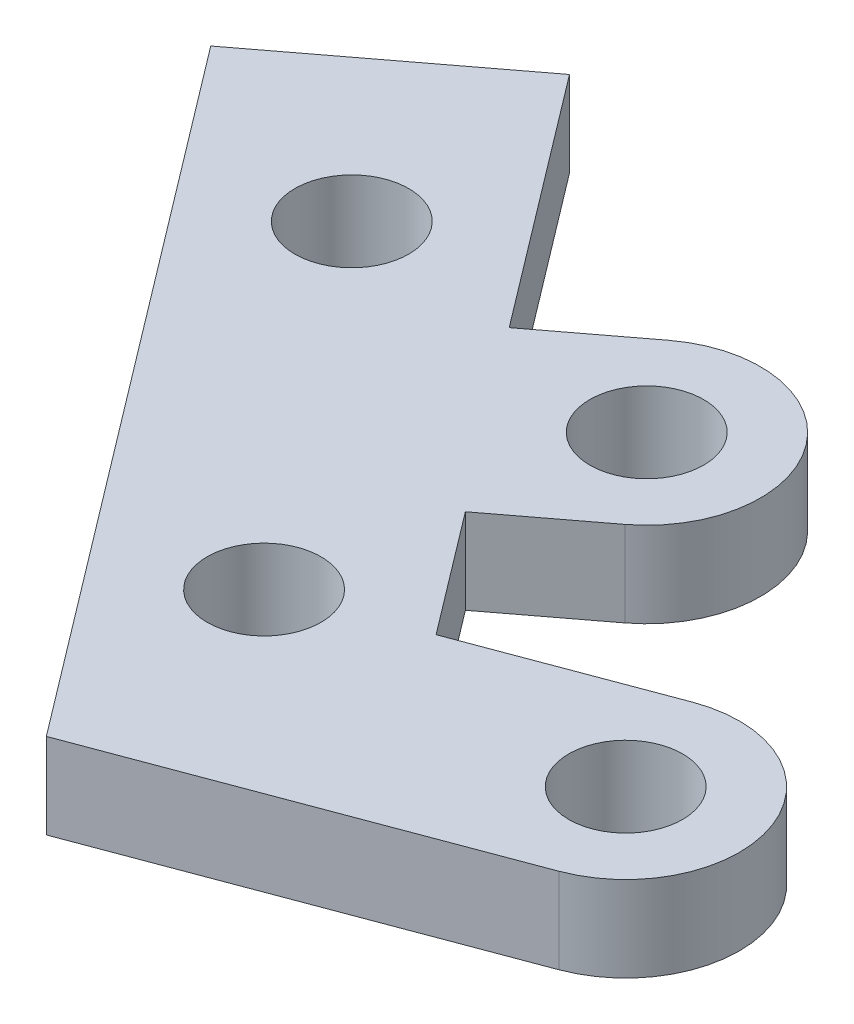
ISO-10303-21;
HEADER;
FILE_DESCRIPTION(('STEP AP214'),'2;1');
FILE_NAME('part.step','',(''),(''),'','','');
FILE_SCHEMA(('AUTOMOTIVE_DESIGN { 1 0 10303 214 1 1 1 1 }'));
ENDSEC;
DATA;
#1=APPLICATION_CONTEXT('core data for automotive mechanical design processes');
#2=APPLICATION_PROTOCOL_DEFINITION('international standard','automotive_design',2000,#1);
#3=PRODUCT_CONTEXT('',#1,'mechanical');
#4=PRODUCT('Part','Part','',(#3));
#5=PRODUCT_RELATED_PRODUCT_CATEGORY('part','',(#4));
#6=PRODUCT_DEFINITION_FORMATION('','',#4);
#7=PRODUCT_DEFINITION_CONTEXT('part definition',#1,'design');
#8=PRODUCT_DEFINITION('design','',#6,#7);
#9=PRODUCT_DEFINITION_SHAPE('','',#8);
#10=(LENGTH_UNIT() NAMED_UNIT(*) SI_UNIT(.MILLI.,.METRE.));
#11=(NAMED_UNIT(*) PLANE_ANGLE_UNIT() SI_UNIT($,.RADIAN.));
#12=(NAMED_UNIT(*) SI_UNIT($,.STERADIAN.) SOLID_ANGLE_UNIT());
#13=UNCERTAINTY_MEASURE_WITH_UNIT(LENGTH_MEASURE(1.E-05),#10,'distance_accuracy_value','');
#14=(GEOMETRIC_REPRESENTATION_CONTEXT(3) GLOBAL_UNCERTAINTY_ASSIGNED_CONTEXT((#13)) GLOBAL_UNIT_ASSIGNED_CONTEXT((#10,
#11,#12)) REPRESENTATION_CONTEXT('',''));
#15=CARTESIAN_POINT('',(0.,0.,0.));
#16=DIRECTION('',(0.,0.,1.));
#17=DIRECTION('',(1.,0.,0.));
#18=AXIS2_PLACEMENT_3D('',#15,#16,#17);
#19=CARTESIAN_POINT('',(74.7409529420616,3.,-139.690728276876));
#20=DIRECTION('',(0.,1.,0.));
#21=DIRECTION('',(0.,0.,1.));
#22=AXIS2_PLACEMENT_3D('',#19,#20,#21);
#23=PLANE('',#22);
#24=CARTESIAN_POINT('',(52.7185962532916,3.,-152.085226713512));
#25=DIRECTION('',(0.,1.,0.));
#26=DIRECTION('',(0.,0.,1.));
#27=AXIS2_PLACEMENT_3D('',#24,#25,#26);
#28=CIRCLE('',#27,1.99999999999998);
#29=CARTESIAN_POINT('',(52.7185962532916,3.,-150.085226713512));
#30=VERTEX_POINT('',#29);
#31=EDGE_CURVE('E224',#30,#30,#28,.T.);
#32=ORIENTED_EDGE('',*,*,#31,.F.);
#33=EDGE_LOOP('',(#32));
#34=FACE_BOUND('',#33,.T.);
#35=CARTESIAN_POINT('',(74.7409529420616,3.,-139.690728276876));
#36=DIRECTION('',(0.,1.,0.));
#37=DIRECTION('',(0.,0.,1.));
#38=AXIS2_PLACEMENT_3D('',#35,#36,#37);
#39=CIRCLE('',#38,2.);
#40=CARTESIAN_POINT('',(74.7409529420616,3.,-137.690728276876));
#41=VERTEX_POINT('',#40);
#42=EDGE_CURVE('E152',#41,#41,#39,.T.);
#43=ORIENTED_EDGE('',*,*,#42,.F.);
#44=EDGE_LOOP('',(#43));
#45=FACE_BOUND('',#44,.T.);
#46=DIRECTION('',(-0.604210332425517,0.,-0.796824870464173));
#47=VECTOR('',#46,1.);
#48=CARTESIAN_POINT('',(58.7211495000825,3.,-151.61687372757));
#49=LINE('',#48,#47);
#50=CARTESIAN_POINT('',(58.7211495000825,3.,-151.61687372757));
#51=VERTEX_POINT('',#50);
#52=CARTESIAN_POINT('',(52.0748358434018,3.,-160.381947302676));
#53=VERTEX_POINT('',#52);
#54=EDGE_CURVE('E167',#51,#53,#49,.T.);
#55=ORIENTED_EDGE('',*,*,#54,.T.);
#56=DIRECTION('',(-0.796824870464177,0.,0.604210332425512));
#57=VECTOR('',#56,1.);
#58=CARTESIAN_POINT('',(52.0748358434018,3.,-160.381947302676));
#59=LINE('',#58,#57);
#60=CARTESIAN_POINT('',(44.9034120092242,3.,-154.944054310847));
#61=VERTEX_POINT('',#60);
#62=EDGE_CURVE('E105',#53,#61,#59,.T.);
#63=ORIENTED_EDGE('',*,*,#62,.T.);
#64=DIRECTION('',(0.60421033242551,0.,0.796824870464178));
#65=VECTOR('',#64,1.);
#66=CARTESIAN_POINT('',(44.9034120092242,3.,-154.944054310847));
#67=LINE('',#66,#65);
#68=CARTESIAN_POINT('',(63.0297219819895,3.,-131.039308196921));
#69=VERTEX_POINT('',#68);
#70=EDGE_CURVE('E188',#61,#69,#67,.T.);
#71=ORIENTED_EDGE('',*,*,#70,.T.);
#72=DIRECTION('',(0.936617517739759,0.,-0.350353572071146));
#73=VECTOR('',#72,1.);
#74=CARTESIAN_POINT('',(76.1423672303462,3.,-135.944258205917));
#75=LINE('',#74,#73);
#76=CARTESIAN_POINT('',(76.1423672303462,3.,-135.944258205917));
#77=VERTEX_POINT('',#76);
#78=EDGE_CURVE('E207',#69,#77,#75,.T.);
#79=ORIENTED_EDGE('',*,*,#78,.T.);
#80=CARTESIAN_POINT('',(74.7409529420616,3.,-139.690728276876));
#81=DIRECTION('',(0.,1.,0.));
#82=DIRECTION('',(0.,0.,1.));
#83=AXIS2_PLACEMENT_3D('',#80,#81,#82);
#84=CIRCLE('',#83,4.00000000000002);
#85=CARTESIAN_POINT('',(73.339538653777,3.,-143.437198347835));
#86=VERTEX_POINT('',#85);
#87=EDGE_CURVE('E204',#77,#86,#84,.T.);
#88=ORIENTED_EDGE('',*,*,#87,.T.);
#89=DIRECTION('',(-0.936617517739759,0.,0.350353572071146));
#90=VECTOR('',#89,1.);
#91=CARTESIAN_POINT('',(66.7832160295986,3.,-140.984723343337));
#92=LINE('',#91,#90);
#93=CARTESIAN_POINT('',(66.7832160295986,3.,-140.984723343337));
#94=VERTEX_POINT('',#93);
#95=EDGE_CURVE('E206',#86,#94,#92,.T.);
#96=ORIENTED_EDGE('',*,*,#95,.T.);
#97=DIRECTION('',(-0.604210332425495,0.,-0.79682487046419));
#98=VECTOR('',#97,1.);
#99=CARTESIAN_POINT('',(66.7832160295986,3.,-140.984723343337));
#100=LINE('',#99,#98);
#101=CARTESIAN_POINT('',(63.5548321594866,3.,-145.242274763857));
#102=VERTEX_POINT('',#101);
#103=EDGE_CURVE('E130',#94,#102,#100,.T.);
#104=ORIENTED_EDGE('',*,*,#103,.T.);
#105=DIRECTION('',(0.796824870464177,0.,-0.604210332425511));
#106=VECTOR('',#105,1.);
#107=CARTESIAN_POINT('',(63.5548321594866,3.,-145.242274763857));
#108=LINE('',#107,#106);
#109=CARTESIAN_POINT('',(66.7421316413433,3.,-147.659116093559));
#110=VERTEX_POINT('',#109);
#111=EDGE_CURVE('E124',#102,#110,#108,.T.);
#112=ORIENTED_EDGE('',*,*,#111,.T.);
#113=CARTESIAN_POINT('',(64.3252903116413,3.,-150.846415575416));
#114=DIRECTION('',(0.,1.,0.));
#115=DIRECTION('',(0.,0.,1.));
#116=AXIS2_PLACEMENT_3D('',#113,#114,#115);
#117=CIRCLE('',#116,4.);
#118=CARTESIAN_POINT('',(61.9084489819392,3.,-154.033715057272));
#119=VERTEX_POINT('',#118);
#120=EDGE_CURVE('E128',#110,#119,#117,.T.);
#121=ORIENTED_EDGE('',*,*,#120,.T.);
#122=DIRECTION('',(-0.796824870464178,0.,0.60421033242551));
#123=VECTOR('',#122,1.);
#124=CARTESIAN_POINT('',(61.9084489819392,3.,-154.033715057272));
#125=LINE('',#124,#123);
#126=EDGE_CURVE('E56',#119,#51,#125,.T.);
#127=ORIENTED_EDGE('',*,*,#126,.T.);
#128=EDGE_LOOP('',(#55,#63,#71,#79,#88,#96,#104,#112,#121,#127));
#129=FACE_BOUND('',#128,.T.);
#130=CARTESIAN_POINT('',(64.3252903116413,3.,-150.846415575416));
#131=DIRECTION('',(0.,1.,0.));
#132=DIRECTION('',(0.,0.,1.));
#133=AXIS2_PLACEMENT_3D('',#130,#131,#132);
#134=CIRCLE('',#133,1.99999999999997);
#135=CARTESIAN_POINT('',(64.3252903116413,3.,-148.846415575416));
#136=VERTEX_POINT('',#135);
#137=EDGE_CURVE('E218',#136,#136,#134,.T.);
#138=ORIENTED_EDGE('',*,*,#137,.F.);
#139=EDGE_LOOP('',(#138));
#140=FACE_BOUND('',#139,.T.);
#141=CARTESIAN_POINT('',(62.3859615720995,3.,-139.336028786086));
#142=DIRECTION('',(0.,1.,0.));
#143=DIRECTION('',(0.,0.,1.));
#144=AXIS2_PLACEMENT_3D('',#141,#142,#143);
#145=CIRCLE('',#144,1.99999999999997);
#146=CARTESIAN_POINT('',(62.3859615720995,3.,-137.336028786086));
#147=VERTEX_POINT('',#146);
#148=EDGE_CURVE('E230',#147,#147,#145,.T.);
#149=ORIENTED_EDGE('',*,*,#148,.F.);
#150=EDGE_LOOP('',(#149));
#151=FACE_BOUND('',#150,.T.);
#152=ADVANCED_FACE('F39',(#34,#45,#129,#140,#151),#23,.T.);
#153=CARTESIAN_POINT('',(74.7409529420616,0.,-139.690728276876));
#154=DIRECTION('',(0.,1.,0.));
#155=DIRECTION('',(0.,0.,1.));
#156=AXIS2_PLACEMENT_3D('',#153,#154,#155);
#157=PLANE('',#156);
#158=DIRECTION('',(-0.604210332425517,0.,-0.796824870464173));
#159=VECTOR('',#158,1.);
#160=CARTESIAN_POINT('',(58.7211495000825,0.,-151.61687372757));
#161=LINE('',#160,#159);
#162=CARTESIAN_POINT('',(58.7211495000825,0.,-151.61687372757));
#163=VERTEX_POINT('',#162);
#164=CARTESIAN_POINT('',(52.0748358434018,0.,-160.381947302676));
#165=VERTEX_POINT('',#164);
#166=EDGE_CURVE('E148',#163,#165,#161,.T.);
#167=ORIENTED_EDGE('',*,*,#166,.F.);
#168=DIRECTION('',(-0.796824870464178,0.,0.60421033242551));
#169=VECTOR('',#168,1.);
#170=CARTESIAN_POINT('',(61.9084489819392,0.,-154.033715057272));
#171=LINE('',#170,#169);
#172=CARTESIAN_POINT('',(61.9084489819392,0.,-154.033715057272));
#173=VERTEX_POINT('',#172);
#174=EDGE_CURVE('E97',#173,#163,#171,.T.);
#175=ORIENTED_EDGE('',*,*,#174,.F.);
#176=CARTESIAN_POINT('',(64.3252903116413,0.,-150.846415575416));
#177=DIRECTION('',(0.,1.,0.));
#178=DIRECTION('',(0.,0.,1.));
#179=AXIS2_PLACEMENT_3D('',#176,#177,#178);
#180=CIRCLE('',#179,4.);
#181=CARTESIAN_POINT('',(66.7421316413433,0.,-147.659116093559));
#182=VERTEX_POINT('',#181);
#183=EDGE_CURVE('E91',#182,#173,#180,.T.);
#184=ORIENTED_EDGE('',*,*,#183,.F.);
#185=DIRECTION('',(0.796824870464177,0.,-0.604210332425511));
#186=VECTOR('',#185,1.);
#187=CARTESIAN_POINT('',(63.5548321594866,0.,-145.242274763857));
#188=LINE('',#187,#186);
#189=CARTESIAN_POINT('',(63.5548321594866,0.,-145.242274763857));
#190=VERTEX_POINT('',#189);
#191=EDGE_CURVE('E138',#190,#182,#188,.T.);
#192=ORIENTED_EDGE('',*,*,#191,.F.);
#193=DIRECTION('',(-0.604210332425495,0.,-0.79682487046419));
#194=VECTOR('',#193,1.);
#195=CARTESIAN_POINT('',(66.7832160295986,0.,-140.984723343337));
#196=LINE('',#195,#194);
#197=CARTESIAN_POINT('',(66.7832160295986,0.,-140.984723343337));
#198=VERTEX_POINT('',#197);
#199=EDGE_CURVE('E162',#198,#190,#196,.T.);
#200=ORIENTED_EDGE('',*,*,#199,.F.);
#201=DIRECTION('',(-0.936617517739759,0.,0.350353572071146));
#202=VECTOR('',#201,1.);
#203=CARTESIAN_POINT('',(66.7832160295986,0.,-140.984723343337));
#204=LINE('',#203,#202);
#205=CARTESIAN_POINT('',(73.339538653777,0.,-143.437198347835));
#206=VERTEX_POINT('',#205);
#207=EDGE_CURVE('E160',#206,#198,#204,.T.);
#208=ORIENTED_EDGE('',*,*,#207,.F.);
#209=CARTESIAN_POINT('',(74.7409529420616,0.,-139.690728276876));
#210=DIRECTION('',(0.,1.,0.));
#211=DIRECTION('',(0.,0.,1.));
#212=AXIS2_PLACEMENT_3D('',#209,#210,#211);
#213=CIRCLE('',#212,4.00000000000002);
#214=CARTESIAN_POINT('',(76.1423672303462,0.,-135.944258205917));
#215=VERTEX_POINT('',#214);
#216=EDGE_CURVE('E158',#215,#206,#213,.T.);
#217=ORIENTED_EDGE('',*,*,#216,.F.);
#218=DIRECTION('',(0.936617517739759,0.,-0.350353572071146));
#219=VECTOR('',#218,1.);
#220=CARTESIAN_POINT('',(76.1423672303462,0.,-135.944258205917));
#221=LINE('',#220,#219);
#222=CARTESIAN_POINT('',(63.0297219819895,0.,-131.039308196921));
#223=VERTEX_POINT('',#222);
#224=EDGE_CURVE('E156',#223,#215,#221,.T.);
#225=ORIENTED_EDGE('',*,*,#224,.F.);
#226=DIRECTION('',(0.60421033242551,0.,0.796824870464178));
#227=VECTOR('',#226,1.);
#228=CARTESIAN_POINT('',(44.9034120092242,0.,-154.944054310847));
#229=LINE('',#228,#227);
#230=CARTESIAN_POINT('',(44.9034120092242,0.,-154.944054310847));
#231=VERTEX_POINT('',#230);
#232=EDGE_CURVE('E154',#231,#223,#229,.T.);
#233=ORIENTED_EDGE('',*,*,#232,.F.);
#234=DIRECTION('',(-0.796824870464177,0.,0.604210332425512));
#235=VECTOR('',#234,1.);
#236=CARTESIAN_POINT('',(52.0748358434018,0.,-160.381947302676));
#237=LINE('',#236,#235);
#238=EDGE_CURVE('E151',#165,#231,#237,.T.);
#239=ORIENTED_EDGE('',*,*,#238,.F.);
#240=EDGE_LOOP('',(#167,#175,#184,#192,#200,#208,#217,#225,#233,#239));
#241=FACE_BOUND('',#240,.T.);
#242=CARTESIAN_POINT('',(74.7409529420616,0.,-139.690728276876));
#243=DIRECTION('',(0.,1.,0.));
#244=DIRECTION('',(0.,0.,1.));
#245=AXIS2_PLACEMENT_3D('',#242,#243,#244);
#246=CIRCLE('',#245,2.);
#247=CARTESIAN_POINT('',(74.7409529420616,0.,-137.690728276876));
#248=VERTEX_POINT('',#247);
#249=EDGE_CURVE('E215',#248,#248,#246,.T.);
#250=ORIENTED_EDGE('',*,*,#249,.T.);
#251=EDGE_LOOP('',(#250));
#252=FACE_BOUND('',#251,.T.);
#253=CARTESIAN_POINT('',(64.3252903116413,0.,-150.846415575416));
#254=DIRECTION('',(0.,1.,0.));
#255=DIRECTION('',(0.,0.,1.));
#256=AXIS2_PLACEMENT_3D('',#253,#254,#255);
#257=CIRCLE('',#256,1.99999999999997);
#258=CARTESIAN_POINT('',(64.3252903116413,0.,-148.846415575416));
#259=VERTEX_POINT('',#258);
#260=EDGE_CURVE('E221',#259,#259,#257,.T.);
#261=ORIENTED_EDGE('',*,*,#260,.T.);
#262=EDGE_LOOP('',(#261));
#263=FACE_BOUND('',#262,.T.);
#264=CARTESIAN_POINT('',(52.7185962532916,0.,-152.085226713512));
#265=DIRECTION('',(0.,1.,0.));
#266=DIRECTION('',(0.,0.,1.));
#267=AXIS2_PLACEMENT_3D('',#264,#265,#266);
#268=CIRCLE('',#267,1.99999999999998);
#269=CARTESIAN_POINT('',(52.7185962532916,0.,-150.085226713512));
#270=VERTEX_POINT('',#269);
#271=EDGE_CURVE('E227',#270,#270,#268,.T.);
#272=ORIENTED_EDGE('',*,*,#271,.T.);
#273=EDGE_LOOP('',(#272));
#274=FACE_BOUND('',#273,.T.);
#275=CARTESIAN_POINT('',(62.3859615720995,0.,-139.336028786086));
#276=DIRECTION('',(0.,1.,0.));
#277=DIRECTION('',(0.,0.,1.));
#278=AXIS2_PLACEMENT_3D('',#275,#276,#277);
#279=CIRCLE('',#278,1.99999999999997);
#280=CARTESIAN_POINT('',(62.3859615720995,0.,-137.336028786086));
#281=VERTEX_POINT('',#280);
#282=EDGE_CURVE('E233',#281,#281,#279,.T.);
#283=ORIENTED_EDGE('',*,*,#282,.T.);
#284=EDGE_LOOP('',(#283));
#285=FACE_BOUND('',#284,.T.);
#286=ADVANCED_FACE('F192',(#241,#252,#263,#274,#285),#157,.F.);
#287=CARTESIAN_POINT('',(58.7211495000825,3.,-151.61687372757));
#288=DIRECTION('',(-0.796824870464173,0.,0.604210332425517));
#289=DIRECTION('',(0.604210332425517,0.,0.796824870464173));
#290=AXIS2_PLACEMENT_3D('',#287,#288,#289);
#291=PLANE('',#290);
#292=ORIENTED_EDGE('',*,*,#166,.T.);
#293=DIRECTION('',(0.,-1.,0.));
#294=VECTOR('',#293,1.);
#295=CARTESIAN_POINT('',(52.0748358434018,3.,-160.381947302676));
#296=LINE('',#295,#294);
#297=EDGE_CURVE('E11',#53,#165,#296,.T.);
#298=ORIENTED_EDGE('',*,*,#297,.F.);
#299=ORIENTED_EDGE('',*,*,#54,.F.);
#300=DIRECTION('',(0.,-1.,0.));
#301=VECTOR('',#300,1.);
#302=CARTESIAN_POINT('',(58.7211495000825,3.,-151.61687372757));
#303=LINE('',#302,#301);
#304=EDGE_CURVE('E144',#51,#163,#303,.T.);
#305=ORIENTED_EDGE('',*,*,#304,.T.);
#306=EDGE_LOOP('',(#292,#298,#299,#305));
#307=FACE_BOUND('',#306,.T.);
#308=ADVANCED_FACE('F41',(#307),#291,.F.);
#309=CARTESIAN_POINT('',(52.0748358434018,3.,-160.381947302676));
#310=DIRECTION('',(0.604210332425512,0.,0.796824870464177));
#311=DIRECTION('',(0.796824870464177,0.,-0.604210332425512));
#312=AXIS2_PLACEMENT_3D('',#309,#310,#311);
#313=PLANE('',#312);
#314=ORIENTED_EDGE('',*,*,#238,.T.);
#315=DIRECTION('',(0.,-1.,0.));
#316=VECTOR('',#315,1.);
#317=CARTESIAN_POINT('',(44.9034120092242,3.,-154.944054310847));
#318=LINE('',#317,#316);
#319=EDGE_CURVE('E48',#61,#231,#318,.T.);
#320=ORIENTED_EDGE('',*,*,#319,.F.);
#321=ORIENTED_EDGE('',*,*,#62,.F.);
#322=ORIENTED_EDGE('',*,*,#297,.T.);
#323=EDGE_LOOP('',(#314,#320,#321,#322));
#324=FACE_BOUND('',#323,.T.);
#325=ADVANCED_FACE('F275',(#324),#313,.F.);
#326=CARTESIAN_POINT('',(44.9034120092242,3.,-154.944054310847));
#327=DIRECTION('',(0.796824870464178,0.,-0.60421033242551));
#328=DIRECTION('',(-0.60421033242551,0.,-0.796824870464178));
#329=AXIS2_PLACEMENT_3D('',#326,#327,#328);
#330=PLANE('',#329);
#331=ORIENTED_EDGE('',*,*,#232,.T.);
#332=DIRECTION('',(0.,-1.,0.));
#333=VECTOR('',#332,1.);
#334=CARTESIAN_POINT('',(63.0297219819895,3.,-131.039308196921));
#335=LINE('',#334,#333);
#336=EDGE_CURVE('E180',#69,#223,#335,.T.);
#337=ORIENTED_EDGE('',*,*,#336,.F.);
#338=ORIENTED_EDGE('',*,*,#70,.F.);
#339=ORIENTED_EDGE('',*,*,#319,.T.);
#340=EDGE_LOOP('',(#331,#337,#338,#339));
#341=FACE_BOUND('',#340,.T.);
#342=ADVANCED_FACE('F186',(#341),#330,.F.);
#343=CARTESIAN_POINT('',(76.1423672303462,3.,-135.944258205917));
#344=DIRECTION('',(-0.350353572071146,0.,-0.936617517739759));
#345=DIRECTION('',(-0.936617517739759,0.,0.350353572071146));
#346=AXIS2_PLACEMENT_3D('',#343,#344,#345);
#347=PLANE('',#346);
#348=ORIENTED_EDGE('',*,*,#224,.T.);
#349=DIRECTION('',(0.,-1.,0.));
#350=VECTOR('',#349,1.);
#351=CARTESIAN_POINT('',(76.1423672303462,3.,-135.944258205917));
#352=LINE('',#351,#350);
#353=EDGE_CURVE('E177',#77,#215,#352,.T.);
#354=ORIENTED_EDGE('',*,*,#353,.F.);
#355=ORIENTED_EDGE('',*,*,#78,.F.);
#356=ORIENTED_EDGE('',*,*,#336,.T.);
#357=EDGE_LOOP('',(#348,#354,#355,#356));
#358=FACE_BOUND('',#357,.T.);
#359=ADVANCED_FACE('F198',(#358),#347,.F.);
#360=CARTESIAN_POINT('',(74.7409529420616,3.,-139.690728276876));
#361=DIRECTION('',(0.,-1.,0.));
#362=DIRECTION('',(0.,0.,-1.));
#363=AXIS2_PLACEMENT_3D('',#360,#361,#362);
#364=CYLINDRICAL_SURFACE('',#363,4.00000000000002);
#365=ORIENTED_EDGE('',*,*,#216,.T.);
#366=DIRECTION('',(0.,-1.,0.));
#367=VECTOR('',#366,1.);
#368=CARTESIAN_POINT('',(73.339538653777,3.,-143.437198347835));
#369=LINE('',#368,#367);
#370=EDGE_CURVE('E174',#86,#206,#369,.T.);
#371=ORIENTED_EDGE('',*,*,#370,.F.);
#372=ORIENTED_EDGE('',*,*,#87,.F.);
#373=ORIENTED_EDGE('',*,*,#353,.T.);
#374=EDGE_LOOP('',(#365,#371,#372,#373));
#375=FACE_BOUND('',#374,.T.);
#376=ADVANCED_FACE('F202',(#375),#364,.T.);
#377=CARTESIAN_POINT('',(66.7832160295986,3.,-140.984723343337));
#378=DIRECTION('',(0.350353572071146,0.,0.936617517739759));
#379=DIRECTION('',(0.936617517739759,0.,-0.350353572071146));
#380=AXIS2_PLACEMENT_3D('',#377,#378,#379);
#381=PLANE('',#380);
#382=ORIENTED_EDGE('',*,*,#207,.T.);
#383=DIRECTION('',(0.,-1.,0.));
#384=VECTOR('',#383,1.);
#385=CARTESIAN_POINT('',(66.7832160295986,3.,-140.984723343337));
#386=LINE('',#385,#384);
#387=EDGE_CURVE('E171',#94,#198,#386,.T.);
#388=ORIENTED_EDGE('',*,*,#387,.F.);
#389=ORIENTED_EDGE('',*,*,#95,.F.);
#390=ORIENTED_EDGE('',*,*,#370,.T.);
#391=EDGE_LOOP('',(#382,#388,#389,#390));
#392=FACE_BOUND('',#391,.T.);
#393=ADVANCED_FACE('F265',(#392),#381,.F.);
#394=CARTESIAN_POINT('',(66.7832160295986,3.,-140.984723343337));
#395=DIRECTION('',(-0.79682487046419,0.,0.604210332425495));
#396=DIRECTION('',(0.604210332425495,0.,0.79682487046419));
#397=AXIS2_PLACEMENT_3D('',#394,#395,#396);
#398=PLANE('',#397);
#399=ORIENTED_EDGE('',*,*,#199,.T.);
#400=DIRECTION('',(0.,-1.,0.));
#401=VECTOR('',#400,1.);
#402=CARTESIAN_POINT('',(63.5548321594866,3.,-145.242274763857));
#403=LINE('',#402,#401);
#404=EDGE_CURVE('E139',#102,#190,#403,.T.);
#405=ORIENTED_EDGE('',*,*,#404,.F.);
#406=ORIENTED_EDGE('',*,*,#103,.F.);
#407=ORIENTED_EDGE('',*,*,#387,.T.);
#408=EDGE_LOOP('',(#399,#405,#406,#407));
#409=FACE_BOUND('',#408,.T.);
#410=ADVANCED_FACE('F262',(#409),#398,.F.);
#411=CARTESIAN_POINT('',(63.5548321594866,3.,-145.242274763857));
#412=DIRECTION('',(-0.604210332425511,0.,-0.796824870464177));
#413=DIRECTION('',(-0.796824870464177,0.,0.604210332425511));
#414=AXIS2_PLACEMENT_3D('',#411,#412,#413);
#415=PLANE('',#414);
#416=ORIENTED_EDGE('',*,*,#191,.T.);
#417=DIRECTION('',(0.,-1.,0.));
#418=VECTOR('',#417,1.);
#419=CARTESIAN_POINT('',(66.7421316413433,3.,-147.659116093559));
#420=LINE('',#419,#418);
#421=EDGE_CURVE('E135',#110,#182,#420,.T.);
#422=ORIENTED_EDGE('',*,*,#421,.F.);
#423=ORIENTED_EDGE('',*,*,#111,.F.);
#424=ORIENTED_EDGE('',*,*,#404,.T.);
#425=EDGE_LOOP('',(#416,#422,#423,#424));
#426=FACE_BOUND('',#425,.T.);
#427=ADVANCED_FACE('F136',(#426),#415,.F.);
#428=CARTESIAN_POINT('',(64.3252903116413,3.,-150.846415575416));
#429=DIRECTION('',(0.,-1.,0.));
#430=DIRECTION('',(0.,0.,-1.));
#431=AXIS2_PLACEMENT_3D('',#428,#429,#430);
#432=CYLINDRICAL_SURFACE('',#431,4.);
#433=ORIENTED_EDGE('',*,*,#183,.T.);
#434=DIRECTION('',(0.,-1.,0.));
#435=VECTOR('',#434,1.);
#436=CARTESIAN_POINT('',(61.9084489819392,3.,-154.033715057272));
#437=LINE('',#436,#435);
#438=EDGE_CURVE('E140',#119,#173,#437,.T.);
#439=ORIENTED_EDGE('',*,*,#438,.F.);
#440=ORIENTED_EDGE('',*,*,#120,.F.);
#441=ORIENTED_EDGE('',*,*,#421,.T.);
#442=EDGE_LOOP('',(#433,#439,#440,#441));
#443=FACE_BOUND('',#442,.T.);
#444=ADVANCED_FACE('F142',(#443),#432,.T.);
#445=CARTESIAN_POINT('',(61.9084489819392,3.,-154.033715057272));
#446=DIRECTION('',(0.60421033242551,0.,0.796824870464178));
#447=DIRECTION('',(0.796824870464178,0.,-0.60421033242551));
#448=AXIS2_PLACEMENT_3D('',#445,#446,#447);
#449=PLANE('',#448);
#450=ORIENTED_EDGE('',*,*,#174,.T.);
#451=ORIENTED_EDGE('',*,*,#304,.F.);
#452=ORIENTED_EDGE('',*,*,#126,.F.);
#453=ORIENTED_EDGE('',*,*,#438,.T.);
#454=EDGE_LOOP('',(#450,#451,#452,#453));
#455=FACE_BOUND('',#454,.T.);
#456=ADVANCED_FACE('F255',(#455),#449,.F.);
#457=CARTESIAN_POINT('',(74.7409529420616,3.,-139.690728276876));
#458=DIRECTION('',(0.,-1.,0.));
#459=DIRECTION('',(0.,0.,-1.));
#460=AXIS2_PLACEMENT_3D('',#457,#458,#459);
#461=CYLINDRICAL_SURFACE('',#460,2.);
#462=ORIENTED_EDGE('',*,*,#42,.T.);
#463=EDGE_LOOP('',(#462));
#464=FACE_BOUND('',#463,.T.);
#465=ORIENTED_EDGE('',*,*,#249,.F.);
#466=EDGE_LOOP('',(#465));
#467=FACE_BOUND('',#466,.T.);
#468=ADVANCED_FACE('F252',(#464,#467),#461,.F.);
#469=CARTESIAN_POINT('',(64.3252903116413,3.,-150.846415575416));
#470=DIRECTION('',(0.,-1.,0.));
#471=DIRECTION('',(0.,0.,-1.));
#472=AXIS2_PLACEMENT_3D('',#469,#470,#471);
#473=CYLINDRICAL_SURFACE('',#472,1.99999999999997);
#474=ORIENTED_EDGE('',*,*,#137,.T.);
#475=EDGE_LOOP('',(#474));
#476=FACE_BOUND('',#475,.T.);
#477=ORIENTED_EDGE('',*,*,#260,.F.);
#478=EDGE_LOOP('',(#477));
#479=FACE_BOUND('',#478,.T.);
#480=ADVANCED_FACE('F350',(#476,#479),#473,.F.);
#481=CARTESIAN_POINT('',(52.7185962532916,3.,-152.085226713512));
#482=DIRECTION('',(0.,-1.,0.));
#483=DIRECTION('',(0.,0.,-1.));
#484=AXIS2_PLACEMENT_3D('',#481,#482,#483);
#485=CYLINDRICAL_SURFACE('',#484,1.99999999999998);
#486=ORIENTED_EDGE('',*,*,#31,.T.);
#487=EDGE_LOOP('',(#486));
#488=FACE_BOUND('',#487,.T.);
#489=ORIENTED_EDGE('',*,*,#271,.F.);
#490=EDGE_LOOP('',(#489));
#491=FACE_BOUND('',#490,.T.);
#492=ADVANCED_FACE('F358',(#488,#491),#485,.F.);
#493=CARTESIAN_POINT('',(62.3859615720995,3.,-139.336028786086));
#494=DIRECTION('',(0.,-1.,0.));
#495=DIRECTION('',(0.,0.,-1.));
#496=AXIS2_PLACEMENT_3D('',#493,#494,#495);
#497=CYLINDRICAL_SURFACE('',#496,1.99999999999997);
#498=ORIENTED_EDGE('',*,*,#148,.T.);
#499=EDGE_LOOP('',(#498));
#500=FACE_BOUND('',#499,.T.);
#501=ORIENTED_EDGE('',*,*,#282,.F.);
#502=EDGE_LOOP('',(#501));
#503=FACE_BOUND('',#502,.T.);
#504=ADVANCED_FACE('F239',(#500,#503),#497,.F.);
#505=CLOSED_SHELL('',(#152,#286,#308,#325,#342,#359,#376,#393,#410,#427,#444,#456,#468,#480,
#492,#504));
#506=MANIFOLD_SOLID_BREP('B2',#505);
#507=ADVANCED_BREP_SHAPE_REPRESENTATION('',(#18,#506),#14);
#508=SHAPE_DEFINITION_REPRESENTATION(#9,#507);
ENDSEC;
END-ISO-10303-21;
